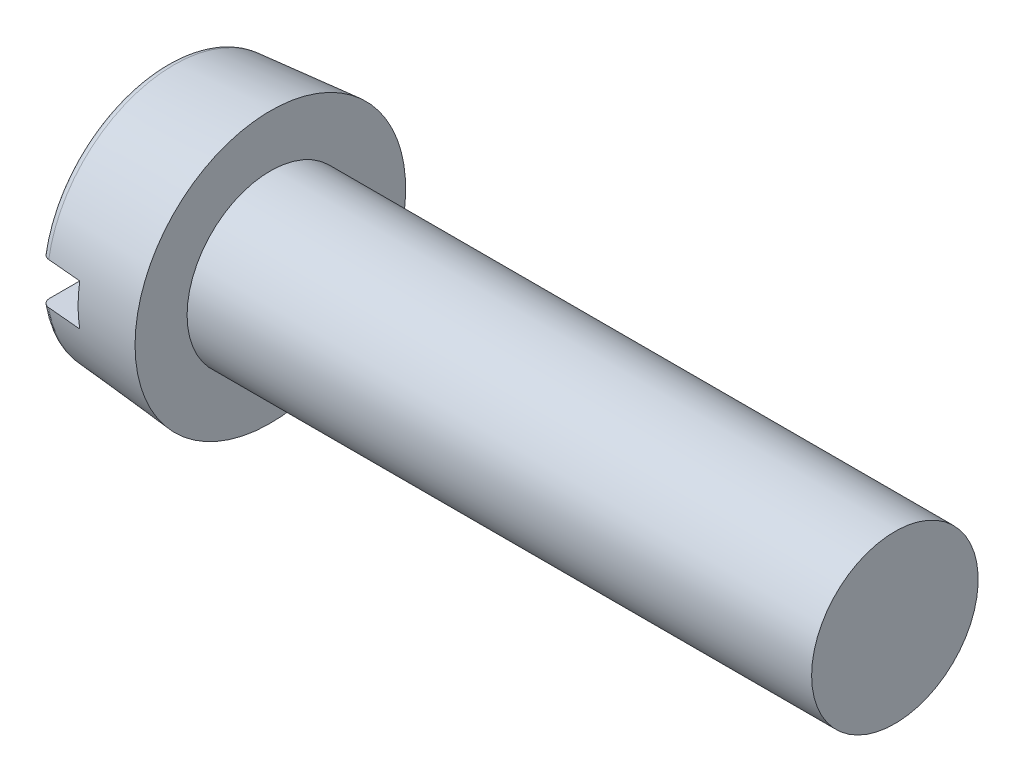
ISO-10303-21;
HEADER;
FILE_DESCRIPTION(('STEP AP214'),'2;1');
FILE_NAME('part.step','',(''),(''),'','','');
FILE_SCHEMA(('AUTOMOTIVE_DESIGN { 1 0 10303 214 1 1 1 1 }'));
ENDSEC;
DATA;
#1=APPLICATION_CONTEXT('core data for automotive mechanical design processes');
#2=APPLICATION_PROTOCOL_DEFINITION('international standard','automotive_design',2000,#1);
#3=PRODUCT_CONTEXT('',#1,'mechanical');
#4=PRODUCT('Part','Part','',(#3));
#5=PRODUCT_RELATED_PRODUCT_CATEGORY('part','',(#4));
#6=PRODUCT_DEFINITION_FORMATION('','',#4);
#7=PRODUCT_DEFINITION_CONTEXT('part definition',#1,'design');
#8=PRODUCT_DEFINITION('design','',#6,#7);
#9=PRODUCT_DEFINITION_SHAPE('','',#8);
#10=(LENGTH_UNIT() NAMED_UNIT(*) SI_UNIT(.MILLI.,.METRE.));
#11=(NAMED_UNIT(*) PLANE_ANGLE_UNIT() SI_UNIT($,.RADIAN.));
#12=(NAMED_UNIT(*) SI_UNIT($,.STERADIAN.) SOLID_ANGLE_UNIT());
#13=UNCERTAINTY_MEASURE_WITH_UNIT(LENGTH_MEASURE(1.E-05),#10,'distance_accuracy_value','');
#14=(GEOMETRIC_REPRESENTATION_CONTEXT(3) GLOBAL_UNCERTAINTY_ASSIGNED_CONTEXT((#13)) GLOBAL_UNIT_ASSIGNED_CONTEXT((#10,
#11,#12)) REPRESENTATION_CONTEXT('',''));
#15=CARTESIAN_POINT('',(0.,0.,0.));
#16=DIRECTION('',(0.,0.,1.));
#17=DIRECTION('',(1.,0.,0.));
#18=AXIS2_PLACEMENT_3D('',#15,#16,#17);
#19=CARTESIAN_POINT('',(0.,0.,0.));
#20=DIRECTION('',(-1.,0.,0.));
#21=DIRECTION('',(0.,0.,1.));
#22=AXIS2_PLACEMENT_3D('',#19,#20,#21);
#23=PLANE('',#22);
#24=DIRECTION('',(0.,0.,-1.));
#25=VECTOR('',#24,1.);
#26=CARTESIAN_POINT('',(0.,1.,6.5));
#27=LINE('',#26,#25);
#28=CARTESIAN_POINT('',(0.,1.,5.60755667224033));
#29=VERTEX_POINT('',#28);
#30=CARTESIAN_POINT('',(0.,1.,-5.60755667224033));
#31=VERTEX_POINT('',#30);
#32=EDGE_CURVE('E108',#29,#31,#27,.T.);
#33=ORIENTED_EDGE('',*,*,#32,.F.);
#34=CARTESIAN_POINT('',(0.,0.,0.));
#35=DIRECTION('',(-1.,0.,0.));
#36=DIRECTION('',(0.,0.,1.));
#37=AXIS2_PLACEMENT_3D('',#34,#35,#36);
#38=CIRCLE('',#37,5.69602421276341);
#39=EDGE_CURVE('E110',#29,#31,#38,.T.);
#40=ORIENTED_EDGE('',*,*,#39,.T.);
#41=EDGE_LOOP('',(#33,#40));
#42=FACE_BOUND('',#41,.T.);
#43=ADVANCED_FACE('F39',(#42),#23,.T.);
#44=CARTESIAN_POINT('',(0.4,0.,0.));
#45=DIRECTION('',(-1.,0.,0.));
#46=DIRECTION('',(0.,0.,1.));
#47=AXIS2_PLACEMENT_3D('',#44,#45,#46);
#48=TOROIDAL_SURFACE('',#47,5.69602421276341,0.4);
#49=CARTESIAN_POINT('',(0.135172099896975,1.,-5.91182128069494));
#50=CARTESIAN_POINT('',(0.151821914009411,1.,-5.92673769271344));
#51=CARTESIAN_POINT('',(0.169731142295993,1.,-5.9402706836111));
#52=CARTESIAN_POINT('',(0.207577314285459,1.,-5.96415623036115));
#53=CARTESIAN_POINT('',(0.227516353102315,1.,-5.97450545479877));
#54=CARTESIAN_POINT('',(0.268854701083141,1.,-5.99169831959272));
#55=CARTESIAN_POINT('',(0.290253962163445,1.,-5.99854207531759));
#56=CARTESIAN_POINT('',(0.33389674643284,1.,-6.0085110708472));
#57=CARTESIAN_POINT('',(0.356140068700145,1.,-6.01163718994555));
#58=CARTESIAN_POINT('',(0.400691986456838,1.,-6.01406970648753));
#59=CARTESIAN_POINT('',(0.422999261022021,1.,-6.01340033654517));
#60=CARTESIAN_POINT('',(0.467183453294596,1.,-6.0083186878302));
#61=CARTESIAN_POINT('',(0.489060365744763,1.,-6.00390636336335));
#62=CARTESIAN_POINT('',(0.53172668168723,1.,-5.99148408850903));
#63=CARTESIAN_POINT('',(0.552517860330045,1.,-5.9834802297955));
#64=CARTESIAN_POINT('',(0.592473370742313,1.,-5.96411724981834));
#65=CARTESIAN_POINT('',(0.611637669847255,1.,-5.95275806120685));
#66=CARTESIAN_POINT('',(0.647933478971877,1.,-5.92693610800607));
#67=CARTESIAN_POINT('',(0.665051053124546,1.,-5.91245376278723));
#68=CARTESIAN_POINT('',(0.696648403719489,1.,-5.88085254996015));
#69=CARTESIAN_POINT('',(0.711128032498661,1.,-5.86373353485913));
#70=CARTESIAN_POINT('',(0.737231779770169,1.,-5.82712127933149));
#71=CARTESIAN_POINT('',(0.748818457188533,1.,-5.80760134826904));
#72=CARTESIAN_POINT('',(0.768601801561786,1.,-5.76691349608657));
#73=CARTESIAN_POINT('',(0.77679821407679,1.,-5.745745451417));
#74=CARTESIAN_POINT('',(0.789684222098998,1.,-5.70204916645589));
#75=CARTESIAN_POINT('',(0.79432382705721,1.,-5.67950617931987));
#76=CARTESIAN_POINT('',(0.799793224650193,1.,-5.63396242226011));
#77=CARTESIAN_POINT('',(0.800622773179506,1.,-5.61096162309975));
#78=CARTESIAN_POINT('',(0.798444297987716,1.,-5.56491558374593));
#79=CARTESIAN_POINT('',(0.795398575858524,1.,-5.54187211813765));
#80=CARTESIAN_POINT('',(0.785486647831649,1.,-5.49662118436444));
#81=CARTESIAN_POINT('',(0.778620347194707,1.,-5.47441373694493));
#82=CARTESIAN_POINT('',(0.761239178148238,1.,-5.43144812244178));
#83=CARTESIAN_POINT('',(0.750720611997857,1.,-5.41069144988063));
#84=CARTESIAN_POINT('',(0.726316515383314,1.,-5.37126075113767));
#85=CARTESIAN_POINT('',(0.712431111062806,1.,-5.35258664696755));
#86=CARTESIAN_POINT('',(0.68181790570508,1.,-5.31804858940892));
#87=CARTESIAN_POINT('',(0.665118132731283,1.,-5.30215980520228));
#88=CARTESIAN_POINT('',(0.629249489386389,1.,-5.27346792085368));
#89=CARTESIAN_POINT('',(0.610080845477982,1.,-5.26066453800529));
#90=CARTESIAN_POINT('',(0.57015471290691,1.,-5.23873254110482));
#91=CARTESIAN_POINT('',(0.549428448649456,1.,-5.2295470871935));
#92=CARTESIAN_POINT('',(0.5067123397414,1.,-5.21484856619889));
#93=CARTESIAN_POINT('',(0.484722619839678,1.,-5.20933513722815));
#94=CARTESIAN_POINT('',(0.440468869881268,1.,-5.20221526996411));
#95=CARTESIAN_POINT('',(0.418214322331201,1.,-5.2005498027041));
#96=CARTESIAN_POINT('',(0.373744638176222,1.,-5.20100517489127));
#97=CARTESIAN_POINT('',(0.35152949963736,1.,-5.20312582308819));
#98=CARTESIAN_POINT('',(0.30791528184165,1.,-5.21105980727748));
#99=CARTESIAN_POINT('',(0.286511930660118,1.,-5.21684970857535));
#100=CARTESIAN_POINT('',(0.244972285128623,1.,-5.23191950660559));
#101=CARTESIAN_POINT('',(0.224836012159161,1.,-5.24119946221022));
#102=CARTESIAN_POINT('',(0.186263634092223,1.,-5.26303328212466));
#103=CARTESIAN_POINT('',(0.167838602004618,1.,-5.27560669513884));
#104=CARTESIAN_POINT('',(0.133320660246739,1.,-5.30362552537909));
#105=CARTESIAN_POINT('',(0.117227920829894,1.,-5.31907115208421));
#106=CARTESIAN_POINT('',(0.0875698628409263,1.,-5.35264194310507));
#107=CARTESIAN_POINT('',(0.0740462941456848,1.,-5.37080398534963));
#108=CARTESIAN_POINT('',(0.0501818200292511,1.,-5.40911058714197));
#109=CARTESIAN_POINT('',(0.0398412027229835,1.,-5.42925532594213));
#110=CARTESIAN_POINT('',(0.0224628219781617,1.,-5.47131160159304));
#111=CARTESIAN_POINT('',(0.0154821496524206,1.,-5.49324673922418));
#112=CARTESIAN_POINT('',(0.00526075068516633,1.,-5.53797121442136));
#113=CARTESIAN_POINT('',(0.00202012974578839,1.,-5.56076057611087));
#114=CARTESIAN_POINT('',(-0.000649038263185963,1.,-5.60679310365412));
#115=CARTESIAN_POINT('',(-3.87987383042536E-05,1.,-5.63003852826141));
#116=CARTESIAN_POINT('',(0.0050752328150243,1.,-5.67610411960468));
#117=CARTESIAN_POINT('',(0.009580037944779,1.,-5.69892417411022));
#118=CARTESIAN_POINT('',(0.022372819405989,1.,-5.7434892316247));
#119=CARTESIAN_POINT('',(0.0306626739323261,1.,-5.76523369496601));
#120=CARTESIAN_POINT('',(0.0508044951099943,1.,-5.80698379029451));
#121=CARTESIAN_POINT('',(0.0626520594115731,1.,-5.82699153210334));
#122=CARTESIAN_POINT('',(0.0847066994741676,1.,-5.85786981912831));
#123=CARTESIAN_POINT('',(0.093962325290934,1.,-5.86943170917014));
#124=CARTESIAN_POINT('',(0.113685464227353,1.,-5.89147146850963));
#125=CARTESIAN_POINT('',(0.124152969229298,1.,-5.90194934506762));
#126=CARTESIAN_POINT('',(0.135172099896975,1.,-5.91182128069494));
#127=B_SPLINE_CURVE_WITH_KNOTS('',3,(#49,#50,#51,#52,#53,#54,#55,#56,#57,#58,#59,#60,#61,#62,
#63,#64,#65,#66,#67,#68,#69,#70,#71,#72,#73,#74,#75,#76,#77,#78,#79,#80,#81,#82,#83,#84,#85,#86,
#87,#88,#89,#90,#91,#92,#93,#94,#95,#96,#97,#98,#99,#100,#101,#102,#103,#104,#105,#106,#107,
#108,#109,#110,#111,#112,#113,#114,#115,#116,#117,#118,#119,#120,#121,#122,#123,#124,#125,#126),
.UNSPECIFIED.,.T.,.F.,(4,2,2,2,2,2,2,2,2,2,2,2,2,2,2,2,2,2,2,2,2,2,2,2,2,2,2,2,2,2,2,2,2,2,2,2,
2,2,4),(0.,0.0670097637811865,0.134089408286544,0.201166844990836,0.26822841341497,
0.334862305801519,0.401497011670736,0.468019121781096,0.534542567207635,0.601495879314743,
0.668452938087024,0.736236229935346,0.804024608007177,0.872749111227342,0.9414780174774,
1.0108806548032,1.08028501318967,1.14975984599425,1.21923207622186,1.28804941821326,
1.35686045227016,1.42454262069852,1.49221811788867,1.55884835410634,1.62547522468738,
1.6916807948406,1.7578874818379,1.82449642035822,1.8911102187722,1.95872803981021,
2.02635197969073,2.09508760886598,2.16382518061476,2.23325618766989,2.30270526139108,
2.3721888342373,2.4415867791735,2.48593527963948,2.53028348305657),.UNSPECIFIED.);
#128=CARTESIAN_POINT('',(0.36513770290092,1.,-6.01190117595039));
#129=VERTEX_POINT('',#128);
#130=EDGE_CURVE('E63',#31,#129,#127,.T.);
#131=ORIENTED_EDGE('',*,*,#130,.F.);
#132=ORIENTED_EDGE('',*,*,#39,.F.);
#133=CARTESIAN_POINT('',(0.303426366753431,1.,5.2128062858958));
#134=CARTESIAN_POINT('',(0.32484522696596,1.,5.20738126624379));
#135=CARTESIAN_POINT('',(0.346736301879438,1.,5.20375790595387));
#136=CARTESIAN_POINT('',(0.390832962720448,1.,5.20024031603832));
#137=CARTESIAN_POINT('',(0.413038868441777,1.,5.20035019732933));
#138=CARTESIAN_POINT('',(0.457106455991739,1.,5.20430121365317));
#139=CARTESIAN_POINT('',(0.478968306480167,1.,5.20814045869492));
#140=CARTESIAN_POINT('',(0.52173378567228,1.,5.21942581968718));
#141=CARTESIAN_POINT('',(0.542637613752372,1.,5.22687118139442));
#142=CARTESIAN_POINT('',(0.58296325119884,1.,5.24516069628728));
#143=CARTESIAN_POINT('',(0.60238122702689,1.,5.25601329534691));
#144=CARTESIAN_POINT('',(0.639151848864702,1.,5.28078406431888));
#145=CARTESIAN_POINT('',(0.656504309145675,1.,5.29470250958833));
#146=CARTESIAN_POINT('',(0.688901965527577,1.,5.32540220446004));
#147=CARTESIAN_POINT('',(0.703913403875146,1.,5.34221906882326));
#148=CARTESIAN_POINT('',(0.730956437107169,1.,5.37809827288662));
#149=CARTESIAN_POINT('',(0.742987771482928,1.,5.39716080867953));
#150=CARTESIAN_POINT('',(0.763940822382266,1.,5.43733589601093));
#151=CARTESIAN_POINT('',(0.772806601717549,1.,5.45847762772227));
#152=CARTESIAN_POINT('',(0.786912736304052,1.,5.50193795570751));
#153=CARTESIAN_POINT('',(0.792152823501973,1.,5.52425663886409));
#154=CARTESIAN_POINT('',(0.798913936333402,1.,5.56973524862114));
#155=CARTESIAN_POINT('',(0.800387885627087,1.,5.59290218641514));
#156=CARTESIAN_POINT('',(0.799438149029029,1.,5.63915671352232));
#157=CARTESIAN_POINT('',(0.797014338934583,1.,5.66224430028347));
#158=CARTESIAN_POINT('',(0.788314316971619,1.,5.70775127689199));
#159=CARTESIAN_POINT('',(0.782027147095799,1.,5.73016857519311));
#160=CARTESIAN_POINT('',(0.765752079118615,1.,5.77361783748486));
#161=CARTESIAN_POINT('',(0.75576427809596,1.,5.79464983779899));
#162=CARTESIAN_POINT('',(0.732437572957297,1.,5.83456605029733));
#163=CARTESIAN_POINT('',(0.719122915732717,1.,5.85346442538329));
#164=CARTESIAN_POINT('',(0.689470534878066,1.,5.88871935421203));
#165=CARTESIAN_POINT('',(0.673133017028879,1.,5.90507608083788));
#166=CARTESIAN_POINT('',(0.638127817824498,1.,5.93455121364289));
#167=CARTESIAN_POINT('',(0.619493680946823,1.,5.94770945432655));
#168=CARTESIAN_POINT('',(0.580256496250167,1.,5.97066029023637));
#169=CARTESIAN_POINT('',(0.559653603863439,1.,5.98045315087746));
#170=CARTESIAN_POINT('',(0.517363683528007,1.,5.99626027656002));
#171=CARTESIAN_POINT('',(0.495695058387785,1.,6.00232379381431));
#172=CARTESIAN_POINT('',(0.451643926632987,1.,6.01069143389602));
#173=CARTESIAN_POINT('',(0.429261461279481,1.,6.01299577360966));
#174=CARTESIAN_POINT('',(0.384624344036175,1.,6.01377048503778));
#175=CARTESIAN_POINT('',(0.362370256117259,1.,6.01227377263475));
#176=CARTESIAN_POINT('',(0.31843067862339,1.,6.00556180930798));
#177=CARTESIAN_POINT('',(0.29674517910427,1.,6.00034662346248));
#178=CARTESIAN_POINT('',(0.254571620465312,1.,5.9863618388267));
#179=CARTESIAN_POINT('',(0.234082661572397,1.,5.97759495126735));
#180=CARTESIAN_POINT('',(0.194852842020945,1.,5.95676968242311));
#181=CARTESIAN_POINT('',(0.176112028366066,1.,5.94471121266926));
#182=CARTESIAN_POINT('',(0.140759510155114,1.,5.91755855734622));
#183=CARTESIAN_POINT('',(0.124164253567962,1.,5.90244296465376));
#184=CARTESIAN_POINT('',(0.093707943194108,1.,5.86967160162822));
#185=CARTESIAN_POINT('',(0.0798470515313557,1.,5.85201568078315));
#186=CARTESIAN_POINT('',(0.055062428581422,1.,5.81442595406676));
#187=CARTESIAN_POINT('',(0.0441783861748329,1.,5.79446598267022));
#188=CARTESIAN_POINT('',(0.0258639588539283,1.,5.75302012812573));
#189=CARTESIAN_POINT('',(0.018433838116974,1.,5.73153412840248));
#190=CARTESIAN_POINT('',(0.00713589351410108,1.,5.68733219957256));
#191=CARTESIAN_POINT('',(0.003318047240515,1.,5.66460349075169));
#192=CARTESIAN_POINT('',(-0.000485367293605405,1.,5.61882729449723));
#193=CARTESIAN_POINT('',(-0.000470694606288329,1.,5.59577978711207));
#194=CARTESIAN_POINT('',(0.00340424113539342,1.,5.54979914374844));
#195=CARTESIAN_POINT('',(0.00729933086031725,1.,5.526868933975));
#196=CARTESIAN_POINT('',(0.0188833943258423,1.,5.48198770702243));
#197=CARTESIAN_POINT('',(0.0265722945437775,1.,5.46003667087627));
#198=CARTESIAN_POINT('',(0.0455386690687492,1.,5.41774889080443));
#199=CARTESIAN_POINT('',(0.0568152967554169,1.,5.397411767446));
#200=CARTESIAN_POINT('',(0.082660389803209,1.,5.35894006925168));
#201=CARTESIAN_POINT('',(0.0972295325450682,1.,5.34080594882942));
#202=CARTESIAN_POINT('',(0.129094824843,1.,5.30746572249958));
#203=CARTESIAN_POINT('',(0.146362318757879,1.,5.29223221050891));
#204=CARTESIAN_POINT('',(0.183234052383626,1.,5.26495563693413));
#205=CARTESIAN_POINT('',(0.202835166261845,1.,5.25290837563444));
#206=CARTESIAN_POINT('',(0.236077426301969,1.,5.23624403024216));
#207=CARTESIAN_POINT('',(0.249183956844827,1.,5.2305372185622));
#208=CARTESIAN_POINT('',(0.275936697591158,1.,5.22057150578372));
#209=CARTESIAN_POINT('',(0.289582902782954,1.,5.21631259124288));
#210=CARTESIAN_POINT('',(0.303426366753431,1.,5.2128062858958));
#211=B_SPLINE_CURVE_WITH_KNOTS('',3,(#133,#134,#135,#136,#137,#138,#139,#140,#141,#142,#143,
#144,#145,#146,#147,#148,#149,#150,#151,#152,#153,#154,#155,#156,#157,#158,#159,#160,#161,#162,
#163,#164,#165,#166,#167,#168,#169,#170,#171,#172,#173,#174,#175,#176,#177,#178,#179,#180,#181,
#182,#183,#184,#185,#186,#187,#188,#189,#190,#191,#192,#193,#194,#195,#196,#197,#198,#199,#200,
#201,#202,#203,#204,#205,#206,#207,#208,#209,#210),.UNSPECIFIED.,.T.,.F.,(4,2,2,2,2,2,2,2,2,2,2,
2,2,2,2,2,2,2,2,2,2,2,2,2,2,2,2,2,2,2,2,2,2,2,2,2,2,2,4),(0.,0.0662336102803064,
0.132540157084772,0.198813118150565,0.265072223768149,0.331496887048582,0.397927518653791,
0.465241717559843,0.532561798727176,0.601018600883683,0.669480463621961,0.738793997118842,
0.808109739345925,0.877623001636835,0.94713444051443,1.01615333181512,1.08516752639039,
1.15327224154404,1.22137158430022,1.28855108360991,1.35572670685315,1.4223225981167,
1.48891732389226,1.55546130934539,1.62200708349982,1.68903605905514,1.75606900764938,
1.82395635793818,1.89184889981877,1.96066759500569,2.02949061677806,2.09893693934542,
2.1683819161212,2.23781051763451,2.30725341596326,2.37600352681535,2.44466256312662,
2.48747114870623,2.53027933683819),.UNSPECIFIED.);
#212=CARTESIAN_POINT('',(0.365137702900976,1.,6.01190117595242));
#213=VERTEX_POINT('',#212);
#214=EDGE_CURVE('E100',#213,#29,#211,.T.);
#215=ORIENTED_EDGE('',*,*,#214,.F.);
#216=CARTESIAN_POINT('',(0.36513770290092,0.,0.));
#217=DIRECTION('',(-1.,0.,0.));
#218=DIRECTION('',(0.,0.,1.));
#219=AXIS2_PLACEMENT_3D('',#216,#217,#218);
#220=CIRCLE('',#219,6.09450209200011);
#221=EDGE_CURVE('E114',#129,#213,#220,.F.);
#222=ORIENTED_EDGE('',*,*,#221,.F.);
#223=EDGE_LOOP('',(#131,#132,#215,#222));
#224=FACE_BOUND('',#223,.T.);
#225=ADVANCED_FACE('F191',(#224),#48,.T.);
#226=CARTESIAN_POINT('',(-25.4,0.,0.));
#227=DIRECTION('',(-1.,0.,0.));
#228=DIRECTION('',(0.,0.,1.));
#229=AXIS2_PLACEMENT_3D('',#226,#227,#228);
#230=CYLINDRICAL_SURFACE('',#229,4.);
#231=CARTESIAN_POINT('',(35.,0.,0.));
#232=DIRECTION('',(-1.,0.,0.));
#233=DIRECTION('',(0.,0.,1.));
#234=AXIS2_PLACEMENT_3D('',#231,#232,#233);
#235=CIRCLE('',#234,4.);
#236=CARTESIAN_POINT('',(35.,0.,4.));
#237=VERTEX_POINT('',#236);
#238=EDGE_CURVE('E111',#237,#237,#235,.T.);
#239=ORIENTED_EDGE('',*,*,#238,.T.);
#240=EDGE_LOOP('',(#239));
#241=FACE_BOUND('',#240,.T.);
#242=CARTESIAN_POINT('',(5.,0.,0.));
#243=DIRECTION('',(-1.,0.,0.));
#244=DIRECTION('',(0.,0.,1.));
#245=AXIS2_PLACEMENT_3D('',#242,#243,#244);
#246=CIRCLE('',#245,4.);
#247=CARTESIAN_POINT('',(5.,0.,4.));
#248=VERTEX_POINT('',#247);
#249=EDGE_CURVE('E178',#248,#248,#246,.T.);
#250=ORIENTED_EDGE('',*,*,#249,.F.);
#251=EDGE_LOOP('',(#250));
#252=FACE_BOUND('',#251,.T.);
#253=ADVANCED_FACE('F188',(#241,#252),#230,.T.);
#254=CARTESIAN_POINT('',(35.,4.,0.));
#255=DIRECTION('',(1.,0.,0.));
#256=DIRECTION('',(0.,0.,-1.));
#257=AXIS2_PLACEMENT_3D('',#254,#255,#256);
#258=PLANE('',#257);
#259=ORIENTED_EDGE('',*,*,#238,.F.);
#260=EDGE_LOOP('',(#259));
#261=FACE_BOUND('',#260,.T.);
#262=ADVANCED_FACE('F190',(#261),#258,.T.);
#263=DIRECTION('',(0.,0.,1.));
#264=VECTOR('',#263,1.);
#265=CARTESIAN_POINT('',(0.,-0.999999999999999,-6.5));
#266=LINE('',#265,#264);
#267=CARTESIAN_POINT('',(0.,-0.999999999999999,-5.60755667224033));
#268=VERTEX_POINT('',#267);
#269=CARTESIAN_POINT('',(0.,-1.,5.60755667224033));
#270=VERTEX_POINT('',#269);
#271=EDGE_CURVE('E55',#268,#270,#266,.T.);
#272=ORIENTED_EDGE('',*,*,#271,.F.);
#273=EDGE_CURVE('E106',#268,#270,#38,.T.);
#274=ORIENTED_EDGE('',*,*,#273,.T.);
#275=EDGE_LOOP('',(#272,#274));
#276=FACE_BOUND('',#275,.T.);
#277=ADVANCED_FACE('F105',(#276),#23,.T.);
#278=CARTESIAN_POINT('',(0.,0.,0.));
#279=DIRECTION('',(1.,0.,0.));
#280=DIRECTION('',(0.,0.,-1.));
#281=AXIS2_PLACEMENT_3D('',#278,#279,#280);
#282=CONICAL_SURFACE('',#281,6.06255668237038,0.0872664625997167);
#283=CARTESIAN_POINT('',(-10.2062273053544,1.,-5.0719866369261));
#284=CARTESIAN_POINT('',(-7.0486295733279,1.,-5.35352345137979));
#285=CARTESIAN_POINT('',(-3.89096200782762,1.,-5.63427500088978));
#286=CARTESIAN_POINT('',(-0.130353328990732,1.,-5.9679585643389));
#287=CARTESIAN_POINT('',(0.472539611579985,1.,-6.02143332256677));
#288=CARTESIAN_POINT('',(4.83606472810648,1.,-6.40832613282583));
#289=CARTESIAN_POINT('',(8.59676075613632,1.,-6.74102438610858));
#290=CARTESIAN_POINT('',(12.3574888119269,1.,-7.07335881115386));
#291=B_SPLINE_CURVE_WITH_KNOTS('',3,(#283,#284,#285,#286,#287,#288,#289,#290),.UNSPECIFIED.,.F.,
.F.,(4,2,2,4),(0.,9.51037176535852,11.3261512190033,22.6523022519196),.UNSPECIFIED.);
#292=CARTESIAN_POINT('',(2.,1.,-6.15685232230715));
#293=VERTEX_POINT('',#292);
#294=EDGE_CURVE('E172',#129,#293,#291,.T.);
#295=ORIENTED_EDGE('',*,*,#294,.F.);
#296=ORIENTED_EDGE('',*,*,#221,.T.);
#297=CARTESIAN_POINT('',(12.3574888119269,1.,7.07335881115386));
#298=CARTESIAN_POINT('',(10.4771231647776,1.,6.9072093022443));
#299=CARTESIAN_POINT('',(8.59676705584065,1.,6.74095174850229));
#300=CARTESIAN_POINT('',(4.83608014489904,1.,6.40815152121686));
#301=CARTESIAN_POINT('',(2.95574934289342,1.,6.24160884768452));
#302=CARTESIAN_POINT('',(-0.804880902602116,1.,5.90816933487298));
#303=CARTESIAN_POINT('',(-2.68518034609149,1.,5.74127249558759));
#304=CARTESIAN_POINT('',(-6.44573762390178,1.,5.40700991965878));
#305=CARTESIAN_POINT('',(-8.32599545822105,1.,5.23964418299698));
#306=CARTESIAN_POINT('',(-10.2062273053544,1.,5.0719866369261));
#307=B_SPLINE_CURVE_WITH_KNOTS('',3,(#297,#298,#299,#300,#301,#302,#303,#304,#305,#306),
.UNSPECIFIED.,.F.,.F.,(4,2,2,2,4),(0.,5.66307564275052,11.3261510654694,16.9892265869889,
22.652302330408),.UNSPECIFIED.);
#308=CARTESIAN_POINT('',(2.,1.,6.15685232230715));
#309=VERTEX_POINT('',#308);
#310=EDGE_CURVE('E167',#309,#213,#307,.T.);
#311=ORIENTED_EDGE('',*,*,#310,.F.);
#312=CARTESIAN_POINT('',(2.,0.,0.));
#313=DIRECTION('',(-1.,0.,0.));
#314=DIRECTION('',(0.,0.,1.));
#315=AXIS2_PLACEMENT_3D('',#312,#313,#314);
#316=CIRCLE('',#315,6.23753400942223);
#317=CARTESIAN_POINT('',(2.,-1.,6.15685232230715));
#318=VERTEX_POINT('',#317);
#319=EDGE_CURVE('E44',#309,#318,#316,.F.);
#320=ORIENTED_EDGE('',*,*,#319,.T.);
#321=CARTESIAN_POINT('',(-10.2062273053544,-1.,5.0719866369261));
#322=CARTESIAN_POINT('',(-7.04862957332795,-1.,5.3535234513798));
#323=CARTESIAN_POINT('',(-3.89096200782762,-1.,5.63427500088978));
#324=CARTESIAN_POINT('',(-0.130353328990731,-1.,5.9679585643389));
#325=CARTESIAN_POINT('',(0.472539611579987,-1.,6.02143332256677));
#326=CARTESIAN_POINT('',(4.83606472810648,-1.,6.40832613282583));
#327=CARTESIAN_POINT('',(8.59676075613626,-1.,6.74102438610858));
#328=CARTESIAN_POINT('',(12.3574888119269,-1.,7.07335881115386));
#329=B_SPLINE_CURVE_WITH_KNOTS('',3,(#321,#322,#323,#324,#325,#326,#327,#328),.UNSPECIFIED.,.F.,
.F.,(4,2,2,4),(0.,9.51037176535852,11.3261512190033,22.6523022519196),.UNSPECIFIED.);
#330=CARTESIAN_POINT('',(0.365137702900561,-1.,6.01190117595203));
#331=VERTEX_POINT('',#330);
#332=EDGE_CURVE('E143',#331,#318,#329,.T.);
#333=ORIENTED_EDGE('',*,*,#332,.F.);
#334=CARTESIAN_POINT('',(0.365137702900457,-0.999999999999999,-6.01190117595249));
#335=VERTEX_POINT('',#334);
#336=EDGE_CURVE('E120',#331,#335,#220,.F.);
#337=ORIENTED_EDGE('',*,*,#336,.T.);
#338=CARTESIAN_POINT('',(12.3574888119269,-0.999999999999999,-7.07335881115386));
#339=CARTESIAN_POINT('',(10.4771231647776,-0.999999999999999,-6.9072093022443));
#340=CARTESIAN_POINT('',(8.59676705584065,-0.999999999999999,-6.74095174850229));
#341=CARTESIAN_POINT('',(4.83608014489904,-0.999999999999999,-6.40815152121686));
#342=CARTESIAN_POINT('',(2.95574934289342,-0.999999999999999,-6.24160884768452));
#343=CARTESIAN_POINT('',(-0.804880902602116,-0.999999999999999,-5.90816933487298));
#344=CARTESIAN_POINT('',(-2.68518034609149,-0.999999999999999,-5.74127249558759));
#345=CARTESIAN_POINT('',(-6.44573762390178,-0.999999999999999,-5.40700991965878));
#346=CARTESIAN_POINT('',(-8.32599545822105,-0.999999999999999,-5.23964418299698));
#347=CARTESIAN_POINT('',(-10.2062273053544,-0.999999999999999,-5.0719866369261));
#348=B_SPLINE_CURVE_WITH_KNOTS('',3,(#338,#339,#340,#341,#342,#343,#344,#345,#346,#347),
.UNSPECIFIED.,.F.,.F.,(4,2,2,2,4),(0.,5.66307564275052,11.3261510654694,16.9892265869889,
22.652302330408),.UNSPECIFIED.);
#349=CARTESIAN_POINT('',(2.,-0.999999999999999,-6.15685232230715));
#350=VERTEX_POINT('',#349);
#351=EDGE_CURVE('E95',#350,#335,#348,.T.);
#352=ORIENTED_EDGE('',*,*,#351,.F.);
#353=EDGE_CURVE('E11',#350,#293,#316,.F.);
#354=ORIENTED_EDGE('',*,*,#353,.T.);
#355=EDGE_LOOP('',(#295,#296,#311,#320,#333,#337,#352,#354));
#356=FACE_BOUND('',#355,.T.);
#357=CARTESIAN_POINT('',(5.,0.,0.));
#358=DIRECTION('',(-1.,0.,0.));
#359=DIRECTION('',(0.,0.,1.));
#360=AXIS2_PLACEMENT_3D('',#357,#358,#359);
#361=CIRCLE('',#360,6.5);
#362=CARTESIAN_POINT('',(5.,0.,6.5));
#363=VERTEX_POINT('',#362);
#364=EDGE_CURVE('E116',#363,#363,#361,.T.);
#365=ORIENTED_EDGE('',*,*,#364,.T.);
#366=EDGE_LOOP('',(#365));
#367=FACE_BOUND('',#366,.T.);
#368=ADVANCED_FACE('F156',(#356,#367),#282,.T.);
#369=CARTESIAN_POINT('',(5.,4.,0.));
#370=DIRECTION('',(-1.,0.,0.));
#371=DIRECTION('',(0.,0.,1.));
#372=AXIS2_PLACEMENT_3D('',#369,#370,#371);
#373=PLANE('',#372);
#374=ORIENTED_EDGE('',*,*,#364,.F.);
#375=EDGE_LOOP('',(#374));
#376=FACE_BOUND('',#375,.T.);
#377=ORIENTED_EDGE('',*,*,#249,.T.);
#378=EDGE_LOOP('',(#377));
#379=FACE_BOUND('',#378,.T.);
#380=ADVANCED_FACE('F160',(#376,#379),#373,.F.);
#381=CARTESIAN_POINT('',(0.135172099896975,-0.999999999999999,-5.91182128069494));
#382=CARTESIAN_POINT('',(0.118193100671154,-0.999999999999999,-5.89660722176038));
#383=CARTESIAN_POINT('',(0.102499284968312,-0.999999999999999,-5.87993171998584));
#384=CARTESIAN_POINT('',(0.0741316995292855,-0.999999999999999,-5.84416021161503));
#385=CARTESIAN_POINT('',(0.0614621150828352,-0.999999999999999,-5.82506090598318));
#386=CARTESIAN_POINT('',(0.0395092175969375,-0.999999999999999,-5.78503170610734));
#387=CARTESIAN_POINT('',(0.0302223259372475,-0.999999999999999,-5.76410377564549));
#388=CARTESIAN_POINT('',(0.0152584930648809,-0.999999999999999,-5.72100282404236));
#389=CARTESIAN_POINT('',(0.00958064410421782,-0.999999999999999,-5.6988301175159));
#390=CARTESIAN_POINT('',(0.00193342643091433,-0.999999999999999,-5.65363170260653));
#391=CARTESIAN_POINT('',(7.0447319407497E-07,-0.999999999999999,-5.63059979083397));
#392=CARTESIAN_POINT('',(-7.04221994620595E-07,-0.999999999999999,-5.58453428741941));
#393=CARTESIAN_POINT('',(0.00193098516985991,-0.999999999999999,-5.56150069583211));
#394=CARTESIAN_POINT('',(0.00963331044920615,-0.999999999999999,-5.51591515376413));
#395=CARTESIAN_POINT('',(0.0154311178615161,-0.999999999999999,-5.49336778668592));
#396=CARTESIAN_POINT('',(0.0307395870672095,-0.999999999999999,-5.4495698065079));
#397=CARTESIAN_POINT('',(0.0402502567404663,-0.999999999999999,-5.42831919616033));
#398=CARTESIAN_POINT('',(0.0627007165406127,-0.999999999999999,-5.38778937953944));
#399=CARTESIAN_POINT('',(0.0756309530258845,-0.999999999999999,-5.36850488511245));
#400=CARTESIAN_POINT('',(0.10458386981394,-0.999999999999999,-5.33241568904238));
#401=CARTESIAN_POINT('',(0.120606357836937,-0.999999999999999,-5.31561083332709));
#402=CARTESIAN_POINT('',(0.155079029994601,-0.999999999999999,-5.28519194946638));
#403=CARTESIAN_POINT('',(0.173496069988341,-0.999999999999999,-5.27154037365234));
#404=CARTESIAN_POINT('',(0.212393215958169,-0.999999999999999,-5.24758650321697));
#405=CARTESIAN_POINT('',(0.232873115913721,-0.999999999999999,-5.23728387456545));
#406=CARTESIAN_POINT('',(0.274938184489842,-0.999999999999999,-5.22050483777579));
#407=CARTESIAN_POINT('',(0.296498454593812,-0.999999999999999,-5.21396599482369));
#408=CARTESIAN_POINT('',(0.340417133365279,-0.999999999999999,-5.20465426857848));
#409=CARTESIAN_POINT('',(0.362775472465756,-0.999999999999999,-5.20188105785706));
#410=CARTESIAN_POINT('',(0.407345637342211,-0.999999999999999,-5.20020110037149));
#411=CARTESIAN_POINT('',(0.429555607468129,-0.999999999999999,-5.20124471773682));
#412=CARTESIAN_POINT('',(0.473482455715797,-0.999999999999999,-5.20705436201639));
#413=CARTESIAN_POINT('',(0.495199346854778,-0.999999999999999,-5.21182029054417));
#414=CARTESIAN_POINT('',(0.537485485116098,-0.999999999999999,-5.22491150678397));
#415=CARTESIAN_POINT('',(0.558056845289251,-0.999999999999999,-5.23322997780549));
#416=CARTESIAN_POINT('',(0.597530424445168,-0.999999999999999,-5.25316937661073));
#417=CARTESIAN_POINT('',(0.616432576417928,-0.999999999999999,-5.26479043689726));
#418=CARTESIAN_POINT('',(0.652239764690626,-0.999999999999999,-5.29112001144487));
#419=CARTESIAN_POINT('',(0.669122966171211,-0.999999999999999,-5.30585820621815));
#420=CARTESIAN_POINT('',(0.700225330581113,-0.999999999999999,-5.33791826068706));
#421=CARTESIAN_POINT('',(0.714444274577856,-0.999999999999999,-5.35524033250018));
#422=CARTESIAN_POINT('',(0.74006434592353,-0.999999999999999,-5.39228221086979));
#423=CARTESIAN_POINT('',(0.751415026196467,-0.999999999999999,-5.41203690965121));
#424=CARTESIAN_POINT('',(0.77069546806732,-0.999999999999999,-5.45315051879748));
#425=CARTESIAN_POINT('',(0.778624939496132,-0.999999999999999,-5.47450956505441));
#426=CARTESIAN_POINT('',(0.790952670244828,-0.999999999999999,-5.51856857721659));
#427=CARTESIAN_POINT('',(0.795296434401286,-0.999999999999999,-5.54128380325673));
#428=CARTESIAN_POINT('',(0.800137478436041,-0.999999999999999,-5.58712101538519));
#429=CARTESIAN_POINT('',(0.800634562573109,-0.999999999999999,-5.61024302211284));
#430=CARTESIAN_POINT('',(0.797755027688659,-0.999999999999999,-5.65640255782223));
#431=CARTESIAN_POINT('',(0.794352216187432,-0.999999999999999,-5.67943846079908));
#432=CARTESIAN_POINT('',(0.783713765611543,-0.999999999999999,-5.72460835754095));
#433=CARTESIAN_POINT('',(0.776478149655843,-0.999999999999999,-5.74674235674526));
#434=CARTESIAN_POINT('',(0.7583948258531,-0.999999999999999,-5.7893884425704));
#435=CARTESIAN_POINT('',(0.747560307846735,-0.999999999999999,-5.80990611813948));
#436=CARTESIAN_POINT('',(0.722562071778176,-0.999999999999999,-5.84880278327773));
#437=CARTESIAN_POINT('',(0.708398531882278,-0.999999999999999,-5.86718188722267));
#438=CARTESIAN_POINT('',(0.677314929091978,-0.999999999999999,-5.90104903771178));
#439=CARTESIAN_POINT('',(0.660428520577037,-0.999999999999999,-5.91656796581454));
#440=CARTESIAN_POINT('',(0.624257880427601,-0.999999999999999,-5.94450165837014));
#441=CARTESIAN_POINT('',(0.604973833349875,-0.999999999999999,-5.9569166615245));
#442=CARTESIAN_POINT('',(0.564847011499434,-0.999999999999999,-5.97810683625571));
#443=CARTESIAN_POINT('',(0.544029948279074,-0.999999999999999,-5.98693070409104));
#444=CARTESIAN_POINT('',(0.501200392570266,-0.999999999999999,-6.00091386508985));
#445=CARTESIAN_POINT('',(0.479188030954155,-0.999999999999999,-6.00607355857368));
#446=CARTESIAN_POINT('',(0.434853511525892,-0.999999999999999,-6.01253247512765));
#447=CARTESIAN_POINT('',(0.412537471215248,-0.999999999999999,-6.0138737569086));
#448=CARTESIAN_POINT('',(0.367992930302864,-0.999999999999999,-6.01277444751139));
#449=CARTESIAN_POINT('',(0.345764450196618,-0.999999999999999,-6.01033301817214));
#450=CARTESIAN_POINT('',(0.302113080998343,-0.999999999999999,-6.00175826346295));
#451=CARTESIAN_POINT('',(0.28068770986946,-0.999999999999999,-5.99563751869804));
#452=CARTESIAN_POINT('',(0.239181641331856,-0.999999999999999,-5.97990332072967));
#453=CARTESIAN_POINT('',(0.219099336670572,-0.999999999999999,-5.97029413404996));
#454=CARTESIAN_POINT('',(0.188409580272963,-0.999999999999999,-5.95232577062788));
#455=CARTESIAN_POINT('',(0.177197891449714,-0.999999999999999,-5.94497705710049));
#456=CARTESIAN_POINT('',(0.155566961989562,-0.999999999999999,-5.9291941419136));
#457=CARTESIAN_POINT('',(0.145147716180443,-0.999999999999999,-5.92075994733993));
#458=CARTESIAN_POINT('',(0.135172099896975,-0.999999999999999,-5.91182128069494));
#459=B_SPLINE_CURVE_WITH_KNOTS('',3,(#381,#382,#383,#384,#385,#386,#387,#388,#389,#390,#391,
#392,#393,#394,#395,#396,#397,#398,#399,#400,#401,#402,#403,#404,#405,#406,#407,#408,#409,#410,
#411,#412,#413,#414,#415,#416,#417,#418,#419,#420,#421,#422,#423,#424,#425,#426,#427,#428,#429,
#430,#431,#432,#433,#434,#435,#436,#437,#438,#439,#440,#441,#442,#443,#444,#445,#446,#447,#448,
#449,#450,#451,#452,#453,#454,#455,#456,#457,#458),.UNSPECIFIED.,.T.,.F.,(4,2,2,2,2,2,2,2,2,2,2,
2,2,2,2,2,2,2,2,2,2,2,2,2,2,2,2,2,2,2,2,2,2,2,2,2,2,2,4),(0.,0.0683446111153,0.136783264241266,
0.205149302964192,0.273498139420047,0.342512470073549,0.411533518328791,0.481044840231932,
0.550556309660985,0.619875591609265,0.689190564592161,0.757631888874404,0.826066384596214,
0.893330275453023,0.960588317222257,1.02697483141804,1.0933595909745,1.15961753842278,
1.22587814457407,1.29280061597488,1.35972858425034,1.42776253331078,1.49580225152243,
1.56485792278248,1.63391710796962,1.70344284014924,1.77296815296374,1.84224141893082,
1.91151097829805,1.97998211228199,2.04844797900129,2.11595174680986,2.18344813852533,
2.2501981451779,2.31696294419967,2.38350074406409,2.44995743782224,2.49011198738065,
2.53026627483078),.UNSPECIFIED.);
#460=EDGE_CURVE('E91',#335,#268,#459,.T.);
#461=ORIENTED_EDGE('',*,*,#460,.F.);
#462=ORIENTED_EDGE('',*,*,#336,.F.);
#463=CARTESIAN_POINT('',(0.303426366753431,-1.,5.2128062858958));
#464=CARTESIAN_POINT('',(0.281737576893756,-1.,5.21830184591189));
#465=CARTESIAN_POINT('',(0.260501039560739,-1.,5.22565313205774));
#466=CARTESIAN_POINT('',(0.219554613110955,-1.,5.24383939680039));
#467=CARTESIAN_POINT('',(0.19984678198602,-1.,5.25467897378669));
#468=CARTESIAN_POINT('',(0.162545014596983,-1.,5.27949115040013));
#469=CARTESIAN_POINT('',(0.144948709601175,-1.,5.29346018794293));
#470=CARTESIAN_POINT('',(0.112322000175259,-1.,5.32411764536127));
#471=CARTESIAN_POINT('',(0.0972910165720668,-1.,5.34080544975293));
#472=CARTESIAN_POINT('',(0.070015725650524,-1.,5.37663728367097));
#473=CARTESIAN_POINT('',(0.0578067916668442,-1.,5.39580823367744));
#474=CARTESIAN_POINT('',(0.0367221869395617,-1.,5.43590384411835));
#475=CARTESIAN_POINT('',(0.0278469270994316,-1.,5.45682872035047));
#476=CARTESIAN_POINT('',(0.0135444880402516,-1.,5.50018950414101));
#477=CARTESIAN_POINT('',(0.00817339449741874,-1.,5.52264392275088));
#478=CARTESIAN_POINT('',(0.00124306005597578,-1.,5.56813392965525));
#479=CARTESIAN_POINT('',(-0.000315965506903015,-1.,5.5911695507064));
#480=CARTESIAN_POINT('',(0.000425099065845309,-1.,5.6373669779457));
#481=CARTESIAN_POINT('',(0.00275664354489853,-1.,5.66052828892574));
#482=CARTESIAN_POINT('',(0.0112833955765563,-1.,5.70612920169889));
#483=CARTESIAN_POINT('',(0.0174786055918708,-1.,5.72856880303196));
#484=CARTESIAN_POINT('',(0.033555608127077,-1.,5.77202971270509));
#485=CARTESIAN_POINT('',(0.0434290679495565,-1.,5.79305410091737));
#486=CARTESIAN_POINT('',(0.0666023790581734,-1.,5.83312215192416));
#487=CARTESIAN_POINT('',(0.0799020641822789,-1.,5.85216591071064));
#488=CARTESIAN_POINT('',(0.109403000030285,-1.,5.88750905641209));
#489=CARTESIAN_POINT('',(0.125571621422699,-1.,5.90383567170733));
#490=CARTESIAN_POINT('',(0.160454773653296,-1.,5.93349529768422));
#491=CARTESIAN_POINT('',(0.179169105329171,-1.,5.94682854233458));
#492=CARTESIAN_POINT('',(0.218329325821669,-1.,5.96992448861963));
#493=CARTESIAN_POINT('',(0.238747134620427,-1.,5.97973480558182));
#494=CARTESIAN_POINT('',(0.280953211845523,-1.,5.99574195622378));
#495=CARTESIAN_POINT('',(0.302741381781812,-1.,6.00193904926371));
#496=CARTESIAN_POINT('',(0.346796191386723,-1.,6.01047638390031));
#497=CARTESIAN_POINT('',(0.36905428172708,-1.,6.01286078450719));
#498=CARTESIAN_POINT('',(0.413653138446655,-1.,6.01383814026431));
#499=CARTESIAN_POINT('',(0.435993901524523,-1.,6.01243124521418));
#500=CARTESIAN_POINT('',(0.480007000838432,-1.,6.00588617517534));
#501=CARTESIAN_POINT('',(0.501682118374841,-1.,6.00076667228241));
#502=CARTESIAN_POINT('',(0.543869393361294,-1.,5.98697296114785));
#503=CARTESIAN_POINT('',(0.564381545534412,-1.,5.97829873677822));
#504=CARTESIAN_POINT('',(0.603738682805426,-1.,5.95762099904274));
#505=CARTESIAN_POINT('',(0.622577928495199,-1.,5.94560656738644));
#506=CARTESIAN_POINT('',(0.657998614390761,-1.,5.91861587838943));
#507=CARTESIAN_POINT('',(0.674579953429378,-1.,5.90363948840969));
#508=CARTESIAN_POINT('',(0.705202717873872,-1.,5.8709877842584));
#509=CARTESIAN_POINT('',(0.7192159352234,-1.,5.85328602152137));
#510=CARTESIAN_POINT('',(0.744119564725377,-1.,5.81580798586515));
#511=CARTESIAN_POINT('',(0.755009756147581,-1.,5.79603156644754));
#512=CARTESIAN_POINT('',(0.773517566835531,-1.,5.75467284158771));
#513=CARTESIAN_POINT('',(0.781087779848671,-1.,5.73306932095139));
#514=CARTESIAN_POINT('',(0.792542462287061,-1.,5.68890630449077));
#515=CARTESIAN_POINT('',(0.796426671037716,-1.,5.66634674117287));
#516=CARTESIAN_POINT('',(0.800439195127521,-1.,5.62062072333949));
#517=CARTESIAN_POINT('',(0.800521576409827,-1.,5.59745022967761));
#518=CARTESIAN_POINT('',(0.796816424434824,-1.,5.55142007013076));
#519=CARTESIAN_POINT('',(0.793028711937722,-1.,5.52856041869185));
#520=CARTESIAN_POINT('',(0.78165524705769,-1.,5.4836837503521));
#521=CARTESIAN_POINT('',(0.774050655647172,-1.,5.46167150203035));
#522=CARTESIAN_POINT('',(0.755234913004679,-1.,5.41924534510295));
#523=CARTESIAN_POINT('',(0.744023796813164,-1.,5.3988314209706));
#524=CARTESIAN_POINT('',(0.718363951700406,-1.,5.36030658463541));
#525=CARTESIAN_POINT('',(0.70393271917302,-1.,5.34218402614238));
#526=CARTESIAN_POINT('',(0.672192746296365,-1.,5.3086636143985));
#527=CARTESIAN_POINT('',(0.654884331331461,-1.,5.29326545344797));
#528=CARTESIAN_POINT('',(0.618145271498074,-1.,5.26587354142662));
#529=CARTESIAN_POINT('',(0.598748948351406,-1.,5.25383376502973));
#530=CARTESIAN_POINT('',(0.558177852010427,-1.,5.23324382637332));
#531=CARTESIAN_POINT('',(0.537002804796441,-1.,5.22469420297924));
#532=CARTESIAN_POINT('',(0.493857933636805,-1.,5.21147531264302));
#533=CARTESIAN_POINT('',(0.471906896986623,-1.,5.20674456794136));
#534=CARTESIAN_POINT('',(0.427539428098481,-1.,5.20108789707364));
#535=CARTESIAN_POINT('',(0.405123652132184,-1.,5.20015692997232));
#536=CARTESIAN_POINT('',(0.369421714973736,-1.,5.2017190013874));
#537=CARTESIAN_POINT('',(0.356070659131341,-1.,5.20299126242003));
#538=CARTESIAN_POINT('',(0.329567786300609,-1.,5.20688924382006));
#539=CARTESIAN_POINT('',(0.31641596698759,-1.,5.20951494838302));
#540=CARTESIAN_POINT('',(0.303426366753431,-1.,5.2128062858958));
#541=B_SPLINE_CURVE_WITH_KNOTS('',3,(#463,#464,#465,#466,#467,#468,#469,#470,#471,#472,#473,
#474,#475,#476,#477,#478,#479,#480,#481,#482,#483,#484,#485,#486,#487,#488,#489,#490,#491,#492,
#493,#494,#495,#496,#497,#498,#499,#500,#501,#502,#503,#504,#505,#506,#507,#508,#509,#510,#511,
#512,#513,#514,#515,#516,#517,#518,#519,#520,#521,#522,#523,#524,#525,#526,#527,#528,#529,#530,
#531,#532,#533,#534,#535,#536,#537,#538,#539,#540),.UNSPECIFIED.,.T.,.F.,(4,2,2,2,2,2,2,2,2,2,2,
2,2,2,2,2,2,2,2,2,2,2,2,2,2,2,2,2,2,2,2,2,2,2,2,2,2,2,4),(0.,0.0670727735256304,
0.134234329472904,0.201319824238265,0.268390153005537,0.336260396299943,0.404139002431581,
0.473078988040516,0.542022867834807,0.611526847580351,0.681030871627949,0.750378389555275,
0.819722544961181,0.888323414370022,0.956918919909231,1.0245489152557,1.09217405546829,
1.15901012817373,1.22584356012734,1.29234317246402,1.35884308651694,1.42556298072701,
1.49228586338812,1.55970265285608,1.62712420605616,1.69547939958681,1.76383942684353,
1.83302517319259,1.90221412396036,1.97174798025418,2.04128116098777,2.11044535750227,
2.17960173746119,2.24775771451916,2.31592421060647,2.38297013591817,2.44992708648558,
2.49009800860568,2.53026846165221),.UNSPECIFIED.);
#542=EDGE_CURVE('E101',#270,#331,#541,.T.);
#543=ORIENTED_EDGE('',*,*,#542,.F.);
#544=ORIENTED_EDGE('',*,*,#273,.F.);
#545=EDGE_LOOP('',(#461,#462,#543,#544));
#546=FACE_BOUND('',#545,.T.);
#547=ADVANCED_FACE('F41',(#546),#48,.T.);
#548=CARTESIAN_POINT('',(2.,1.,6.5));
#549=DIRECTION('',(0.,1.,0.));
#550=DIRECTION('',(0.,0.,1.));
#551=AXIS2_PLACEMENT_3D('',#548,#549,#550);
#552=PLANE('',#551);
#553=ORIENTED_EDGE('',*,*,#294,.T.);
#554=DIRECTION('',(0.,0.,-1.));
#555=VECTOR('',#554,1.);
#556=CARTESIAN_POINT('',(2.,1.,6.5));
#557=LINE('',#556,#555);
#558=EDGE_CURVE('E107',#309,#293,#557,.T.);
#559=ORIENTED_EDGE('',*,*,#558,.F.);
#560=ORIENTED_EDGE('',*,*,#310,.T.);
#561=ORIENTED_EDGE('',*,*,#214,.T.);
#562=ORIENTED_EDGE('',*,*,#32,.T.);
#563=ORIENTED_EDGE('',*,*,#130,.T.);
#564=EDGE_LOOP('',(#553,#559,#560,#561,#562,#563));
#565=FACE_BOUND('',#564,.T.);
#566=ADVANCED_FACE('F135',(#565),#552,.F.);
#567=CARTESIAN_POINT('',(2.,-0.999999999999999,-6.5));
#568=DIRECTION('',(0.,-1.,0.));
#569=DIRECTION('',(0.,0.,-1.));
#570=AXIS2_PLACEMENT_3D('',#567,#568,#569);
#571=PLANE('',#570);
#572=ORIENTED_EDGE('',*,*,#351,.T.);
#573=ORIENTED_EDGE('',*,*,#460,.T.);
#574=ORIENTED_EDGE('',*,*,#271,.T.);
#575=ORIENTED_EDGE('',*,*,#542,.T.);
#576=ORIENTED_EDGE('',*,*,#332,.T.);
#577=DIRECTION('',(0.,0.,1.));
#578=VECTOR('',#577,1.);
#579=CARTESIAN_POINT('',(2.,-0.999999999999999,-6.5));
#580=LINE('',#579,#578);
#581=EDGE_CURVE('E149',#350,#318,#580,.T.);
#582=ORIENTED_EDGE('',*,*,#581,.F.);
#583=EDGE_LOOP('',(#572,#573,#574,#575,#576,#582));
#584=FACE_BOUND('',#583,.T.);
#585=ADVANCED_FACE('F92',(#584),#571,.F.);
#586=CARTESIAN_POINT('',(2.,1.,-6.5));
#587=DIRECTION('',(-1.,0.,0.));
#588=DIRECTION('',(0.,0.,1.));
#589=AXIS2_PLACEMENT_3D('',#586,#587,#588);
#590=PLANE('',#589);
#591=ORIENTED_EDGE('',*,*,#581,.T.);
#592=ORIENTED_EDGE('',*,*,#319,.F.);
#593=ORIENTED_EDGE('',*,*,#558,.T.);
#594=ORIENTED_EDGE('',*,*,#353,.F.);
#595=EDGE_LOOP('',(#591,#592,#593,#594));
#596=FACE_BOUND('',#595,.T.);
#597=ADVANCED_FACE('F134',(#596),#590,.T.);
#598=CLOSED_SHELL('',(#43,#225,#253,#262,#277,#368,#380,#547,#566,#585,#597));
#599=MANIFOLD_SOLID_BREP('B2',#598);
#600=ADVANCED_BREP_SHAPE_REPRESENTATION('',(#18,#599),#14);
#601=SHAPE_DEFINITION_REPRESENTATION(#9,#600);
ENDSEC;
END-ISO-10303-21;
